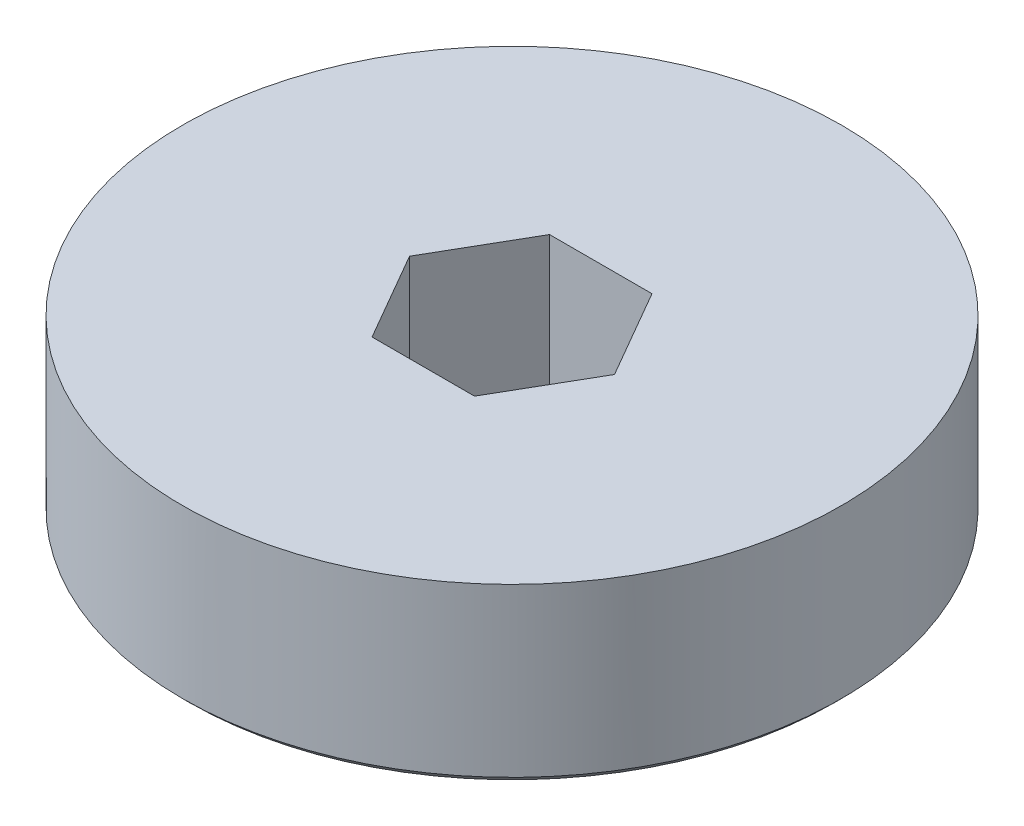
ISO-10303-21;
HEADER;
FILE_DESCRIPTION(('STEP AP214'),'2;1');
FILE_NAME('part.step','',(''),(''),'','','');
FILE_SCHEMA(('AUTOMOTIVE_DESIGN { 1 0 10303 214 1 1 1 1 }'));
ENDSEC;
DATA;
#1=APPLICATION_CONTEXT('core data for automotive mechanical design processes');
#2=APPLICATION_PROTOCOL_DEFINITION('international standard','automotive_design',2000,#1);
#3=PRODUCT_CONTEXT('',#1,'mechanical');
#4=PRODUCT('Part','Part','',(#3));
#5=PRODUCT_RELATED_PRODUCT_CATEGORY('part','',(#4));
#6=PRODUCT_DEFINITION_FORMATION('','',#4);
#7=PRODUCT_DEFINITION_CONTEXT('part definition',#1,'design');
#8=PRODUCT_DEFINITION('design','',#6,#7);
#9=PRODUCT_DEFINITION_SHAPE('','',#8);
#10=(LENGTH_UNIT() NAMED_UNIT(*) SI_UNIT(.MILLI.,.METRE.));
#11=(NAMED_UNIT(*) PLANE_ANGLE_UNIT() SI_UNIT($,.RADIAN.));
#12=(NAMED_UNIT(*) SI_UNIT($,.STERADIAN.) SOLID_ANGLE_UNIT());
#13=UNCERTAINTY_MEASURE_WITH_UNIT(LENGTH_MEASURE(1.E-05),#10,'distance_accuracy_value','');
#14=(GEOMETRIC_REPRESENTATION_CONTEXT(3) GLOBAL_UNCERTAINTY_ASSIGNED_CONTEXT((#13)) GLOBAL_UNIT_ASSIGNED_CONTEXT((#10,
#11,#12)) REPRESENTATION_CONTEXT('',''));
#15=CARTESIAN_POINT('',(0.,0.,0.));
#16=DIRECTION('',(0.,0.,1.));
#17=DIRECTION('',(1.,0.,0.));
#18=AXIS2_PLACEMENT_3D('',#15,#16,#17);
#19=CARTESIAN_POINT('',(0.,-10.16,0.));
#20=DIRECTION('',(0.,-1.,0.));
#21=DIRECTION('',(0.,0.,-1.));
#22=AXIS2_PLACEMENT_3D('',#19,#20,#21);
#23=CYLINDRICAL_SURFACE('',#22,7.9375);
#24=CARTESIAN_POINT('',(0.,-9.398,0.));
#25=DIRECTION('',(0.,-1.,0.));
#26=DIRECTION('',(0.,0.,-1.));
#27=AXIS2_PLACEMENT_3D('',#24,#25,#26);
#28=CIRCLE('',#27,7.9375);
#29=CARTESIAN_POINT('',(0.,-9.398,-7.9375));
#30=VERTEX_POINT('',#29);
#31=EDGE_CURVE('E79',#30,#30,#28,.F.);
#32=ORIENTED_EDGE('',*,*,#31,.F.);
#33=EDGE_LOOP('',(#32));
#34=FACE_BOUND('',#33,.T.);
#35=CARTESIAN_POINT('',(0.,-10.16,0.));
#36=DIRECTION('',(0.,-1.,0.));
#37=DIRECTION('',(0.,0.,-1.));
#38=AXIS2_PLACEMENT_3D('',#35,#36,#37);
#39=CIRCLE('',#38,7.9375);
#40=CARTESIAN_POINT('',(0.,-10.16,-7.9375));
#41=VERTEX_POINT('',#40);
#42=EDGE_CURVE('E20',#41,#41,#39,.F.);
#43=ORIENTED_EDGE('',*,*,#42,.T.);
#44=EDGE_LOOP('',(#43));
#45=FACE_BOUND('',#44,.T.);
#46=ADVANCED_FACE('F17',(#34,#45),#23,.T.);
#47=CARTESIAN_POINT('',(0.,-10.16,0.));
#48=DIRECTION('',(0.,1.,0.));
#49=DIRECTION('',(0.,0.,1.));
#50=AXIS2_PLACEMENT_3D('',#47,#48,#49);
#51=PLANE('',#50);
#52=DIRECTION('',(-1.,0.,0.));
#53=VECTOR('',#52,1.);
#54=CARTESIAN_POINT('',(-2.76429535385301,-10.16,4.78790000000001));
#55=LINE('',#54,#53);
#56=CARTESIAN_POINT('',(2.764295353853,-10.16,4.78790000000001));
#57=VERTEX_POINT('',#56);
#58=CARTESIAN_POINT('',(-2.76429535385301,-10.16,4.78790000000001));
#59=VERTEX_POINT('',#58);
#60=EDGE_CURVE('E71',#57,#59,#55,.T.);
#61=ORIENTED_EDGE('',*,*,#60,.F.);
#62=DIRECTION('',(-0.5,0.,0.866025403784439));
#63=VECTOR('',#62,1.);
#64=CARTESIAN_POINT('',(2.764295353853,-10.16,4.78790000000001));
#65=LINE('',#64,#63);
#66=CARTESIAN_POINT('',(5.52859070770601,-10.16,0.));
#67=VERTEX_POINT('',#66);
#68=EDGE_CURVE('E68',#67,#57,#65,.T.);
#69=ORIENTED_EDGE('',*,*,#68,.F.);
#70=DIRECTION('',(0.499999999999999,0.,0.866025403784439));
#71=VECTOR('',#70,1.);
#72=CARTESIAN_POINT('',(5.52859070770601,-10.16,0.));
#73=LINE('',#72,#71);
#74=CARTESIAN_POINT('',(2.764295353853,-10.16,-4.78789999999999));
#75=VERTEX_POINT('',#74);
#76=EDGE_CURVE('E88',#75,#67,#73,.T.);
#77=ORIENTED_EDGE('',*,*,#76,.F.);
#78=DIRECTION('',(1.,0.,0.));
#79=VECTOR('',#78,1.);
#80=CARTESIAN_POINT('',(2.764295353853,-10.16,-4.78789999999999));
#81=LINE('',#80,#79);
#82=CARTESIAN_POINT('',(-2.76429535385301,-10.16,-4.78789999999999));
#83=VERTEX_POINT('',#82);
#84=EDGE_CURVE('E203',#83,#75,#81,.T.);
#85=ORIENTED_EDGE('',*,*,#84,.F.);
#86=DIRECTION('',(0.5,0.,-0.866025403784439));
#87=VECTOR('',#86,1.);
#88=CARTESIAN_POINT('',(-2.76429535385301,-10.16,-4.78789999999999));
#89=LINE('',#88,#87);
#90=CARTESIAN_POINT('',(-5.52859070770602,-10.16,0.));
#91=VERTEX_POINT('',#90);
#92=EDGE_CURVE('E208',#91,#83,#89,.T.);
#93=ORIENTED_EDGE('',*,*,#92,.F.);
#94=DIRECTION('',(-0.5,0.,-0.866025403784439));
#95=VECTOR('',#94,1.);
#96=CARTESIAN_POINT('',(-5.52859070770602,-10.16,0.));
#97=LINE('',#96,#95);
#98=EDGE_CURVE('E76',#59,#91,#97,.T.);
#99=ORIENTED_EDGE('',*,*,#98,.F.);
#100=EDGE_LOOP('',(#61,#69,#77,#85,#93,#99));
#101=FACE_BOUND('',#100,.T.);
#102=ORIENTED_EDGE('',*,*,#42,.F.);
#103=EDGE_LOOP('',(#102));
#104=FACE_BOUND('',#103,.T.);
#105=ADVANCED_FACE('F73',(#101,#104),#51,.F.);
#106=CARTESIAN_POINT('',(0.,-9.398,0.));
#107=DIRECTION('',(0.,-1.,0.));
#108=DIRECTION('',(0.,0.,-1.));
#109=AXIS2_PLACEMENT_3D('',#106,#107,#108);
#110=PLANE('',#109);
#111=ORIENTED_EDGE('',*,*,#31,.T.);
#112=EDGE_LOOP('',(#111));
#113=FACE_BOUND('',#112,.T.);
#114=CARTESIAN_POINT('',(0.,-9.398,0.));
#115=DIRECTION('',(0.,1.,0.));
#116=DIRECTION('',(0.,0.,1.));
#117=AXIS2_PLACEMENT_3D('',#114,#115,#116);
#118=CIRCLE('',#117,17.399);
#119=CARTESIAN_POINT('',(0.,-9.398,17.399));
#120=VERTEX_POINT('',#119);
#121=EDGE_CURVE('E97',#120,#120,#118,.T.);
#122=ORIENTED_EDGE('',*,*,#121,.F.);
#123=EDGE_LOOP('',(#122));
#124=FACE_BOUND('',#123,.T.);
#125=ADVANCED_FACE('F107',(#113,#124),#110,.T.);
#126=CARTESIAN_POINT('',(-2.76429535385301,41.1454850868793,4.78790000000001));
#127=DIRECTION('',(0.,0.,-1.));
#128=DIRECTION('',(-1.,0.,0.));
#129=AXIS2_PLACEMENT_3D('',#126,#127,#128);
#130=PLANE('',#129);
#131=ORIENTED_EDGE('',*,*,#60,.T.);
#132=DIRECTION('',(0.,1.,0.));
#133=VECTOR('',#132,1.);
#134=CARTESIAN_POINT('',(-2.76429535385301,41.1454850868793,4.78790000000001));
#135=LINE('',#134,#133);
#136=CARTESIAN_POINT('',(-2.76429535385301,0.,4.78790000000001));
#137=VERTEX_POINT('',#136);
#138=EDGE_CURVE('E213',#137,#59,#135,.F.);
#139=ORIENTED_EDGE('',*,*,#138,.F.);
#140=DIRECTION('',(1.,0.,0.));
#141=VECTOR('',#140,1.);
#142=CARTESIAN_POINT('',(0.,0.,4.78790000000001));
#143=LINE('',#142,#141);
#144=CARTESIAN_POINT('',(2.764295353853,0.,4.78790000000001));
#145=VERTEX_POINT('',#144);
#146=EDGE_CURVE('E85',#137,#145,#143,.T.);
#147=ORIENTED_EDGE('',*,*,#146,.T.);
#148=DIRECTION('',(0.,1.,0.));
#149=VECTOR('',#148,1.);
#150=CARTESIAN_POINT('',(2.764295353853,41.1454850868793,4.78790000000001));
#151=LINE('',#150,#149);
#152=EDGE_CURVE('E82',#57,#145,#151,.T.);
#153=ORIENTED_EDGE('',*,*,#152,.F.);
#154=EDGE_LOOP('',(#131,#139,#147,#153));
#155=FACE_BOUND('',#154,.T.);
#156=ADVANCED_FACE('F83',(#155),#130,.T.);
#157=CARTESIAN_POINT('',(2.764295353853,41.1454850868793,4.78790000000001));
#158=DIRECTION('',(-0.866025403784439,0.,-0.5));
#159=DIRECTION('',(-0.5,0.,0.866025403784439));
#160=AXIS2_PLACEMENT_3D('',#157,#158,#159);
#161=PLANE('',#160);
#162=ORIENTED_EDGE('',*,*,#68,.T.);
#163=ORIENTED_EDGE('',*,*,#152,.T.);
#164=DIRECTION('',(0.5,0.,-0.866025403784439));
#165=VECTOR('',#164,1.);
#166=CARTESIAN_POINT('',(2.764295353853,0.,4.78790000000001));
#167=LINE('',#166,#165);
#168=CARTESIAN_POINT('',(5.52859070770601,0.,0.));
#169=VERTEX_POINT('',#168);
#170=EDGE_CURVE('E218',#145,#169,#167,.T.);
#171=ORIENTED_EDGE('',*,*,#170,.T.);
#172=DIRECTION('',(0.,1.,0.));
#173=VECTOR('',#172,1.);
#174=CARTESIAN_POINT('',(5.52859070770601,41.1454850868793,0.));
#175=LINE('',#174,#173);
#176=EDGE_CURVE('E92',#67,#169,#175,.T.);
#177=ORIENTED_EDGE('',*,*,#176,.F.);
#178=EDGE_LOOP('',(#162,#163,#171,#177));
#179=FACE_BOUND('',#178,.T.);
#180=ADVANCED_FACE('F90',(#179),#161,.T.);
#181=CARTESIAN_POINT('',(5.52859070770601,41.1454850868793,0.));
#182=DIRECTION('',(-0.866025403784439,0.,0.499999999999999));
#183=DIRECTION('',(0.499999999999999,0.,0.866025403784439));
#184=AXIS2_PLACEMENT_3D('',#181,#182,#183);
#185=PLANE('',#184);
#186=ORIENTED_EDGE('',*,*,#76,.T.);
#187=ORIENTED_EDGE('',*,*,#176,.T.);
#188=DIRECTION('',(-0.499999999999999,0.,-0.866025403784439));
#189=VECTOR('',#188,1.);
#190=CARTESIAN_POINT('',(5.52859070770601,0.,0.));
#191=LINE('',#190,#189);
#192=CARTESIAN_POINT('',(2.764295353853,0.,-4.7879));
#193=VERTEX_POINT('',#192);
#194=EDGE_CURVE('E220',#169,#193,#191,.T.);
#195=ORIENTED_EDGE('',*,*,#194,.T.);
#196=DIRECTION('',(0.,1.,0.));
#197=VECTOR('',#196,1.);
#198=CARTESIAN_POINT('',(2.764295353853,41.1454850868793,-4.78789999999999));
#199=LINE('',#198,#197);
#200=EDGE_CURVE('E201',#75,#193,#199,.T.);
#201=ORIENTED_EDGE('',*,*,#200,.F.);
#202=EDGE_LOOP('',(#186,#187,#195,#201));
#203=FACE_BOUND('',#202,.T.);
#204=ADVANCED_FACE('F141',(#203),#185,.T.);
#205=CARTESIAN_POINT('',(2.764295353853,41.1454850868793,-4.78789999999999));
#206=DIRECTION('',(0.,0.,1.));
#207=DIRECTION('',(1.,0.,0.));
#208=AXIS2_PLACEMENT_3D('',#205,#206,#207);
#209=PLANE('',#208);
#210=ORIENTED_EDGE('',*,*,#84,.T.);
#211=ORIENTED_EDGE('',*,*,#200,.T.);
#212=DIRECTION('',(1.,0.,0.));
#213=VECTOR('',#212,1.);
#214=CARTESIAN_POINT('',(0.,0.,-4.7879));
#215=LINE('',#214,#213);
#216=CARTESIAN_POINT('',(-2.76429535385301,0.,-4.78789999999999));
#217=VERTEX_POINT('',#216);
#218=EDGE_CURVE('E222',#193,#217,#215,.F.);
#219=ORIENTED_EDGE('',*,*,#218,.T.);
#220=DIRECTION('',(0.,1.,0.));
#221=VECTOR('',#220,1.);
#222=CARTESIAN_POINT('',(-2.76429535385301,41.1454850868793,-4.78789999999999));
#223=LINE('',#222,#221);
#224=EDGE_CURVE('E211',#83,#217,#223,.T.);
#225=ORIENTED_EDGE('',*,*,#224,.F.);
#226=EDGE_LOOP('',(#210,#211,#219,#225));
#227=FACE_BOUND('',#226,.T.);
#228=ADVANCED_FACE('F138',(#227),#209,.T.);
#229=CARTESIAN_POINT('',(-2.76429535385301,41.1454850868793,-4.78789999999999));
#230=DIRECTION('',(0.866025403784439,0.,0.5));
#231=DIRECTION('',(0.5,0.,-0.866025403784439));
#232=AXIS2_PLACEMENT_3D('',#229,#230,#231);
#233=PLANE('',#232);
#234=ORIENTED_EDGE('',*,*,#92,.T.);
#235=ORIENTED_EDGE('',*,*,#224,.T.);
#236=DIRECTION('',(-0.5,0.,0.866025403784438));
#237=VECTOR('',#236,1.);
#238=CARTESIAN_POINT('',(-2.76429535385301,0.,-4.78789999999999));
#239=LINE('',#238,#237);
#240=CARTESIAN_POINT('',(-5.52859070770602,0.,0.));
#241=VERTEX_POINT('',#240);
#242=EDGE_CURVE('E35',#217,#241,#239,.T.);
#243=ORIENTED_EDGE('',*,*,#242,.T.);
#244=DIRECTION('',(0.,1.,0.));
#245=VECTOR('',#244,1.);
#246=CARTESIAN_POINT('',(-5.52859070770602,41.1454850868793,0.));
#247=LINE('',#246,#245);
#248=EDGE_CURVE('E99',#91,#241,#247,.T.);
#249=ORIENTED_EDGE('',*,*,#248,.F.);
#250=EDGE_LOOP('',(#234,#235,#243,#249));
#251=FACE_BOUND('',#250,.T.);
#252=ADVANCED_FACE('F134',(#251),#233,.T.);
#253=CARTESIAN_POINT('',(-5.52859070770602,41.1454850868793,0.));
#254=DIRECTION('',(0.866025403784439,0.,-0.5));
#255=DIRECTION('',(-0.5,0.,-0.866025403784439));
#256=AXIS2_PLACEMENT_3D('',#253,#254,#255);
#257=PLANE('',#256);
#258=ORIENTED_EDGE('',*,*,#98,.T.);
#259=ORIENTED_EDGE('',*,*,#248,.T.);
#260=DIRECTION('',(0.5,0.,0.866025403784439));
#261=VECTOR('',#260,1.);
#262=CARTESIAN_POINT('',(-5.52859070770602,0.,0.));
#263=LINE('',#262,#261);
#264=EDGE_CURVE('E225',#241,#137,#263,.T.);
#265=ORIENTED_EDGE('',*,*,#264,.T.);
#266=ORIENTED_EDGE('',*,*,#138,.T.);
#267=EDGE_LOOP('',(#258,#259,#265,#266));
#268=FACE_BOUND('',#267,.T.);
#269=ADVANCED_FACE('F130',(#268),#257,.T.);
#270=CARTESIAN_POINT('',(0.,-9.017,0.));
#271=DIRECTION('',(0.,1.,0.));
#272=DIRECTION('',(0.,0.,1.));
#273=AXIS2_PLACEMENT_3D('',#270,#271,#272);
#274=CONICAL_SURFACE('',#273,17.78,0.785398163397448);
#275=ORIENTED_EDGE('',*,*,#121,.T.);
#276=EDGE_LOOP('',(#275));
#277=FACE_BOUND('',#276,.T.);
#278=CARTESIAN_POINT('',(0.,-9.017,0.));
#279=DIRECTION('',(0.,-1.,0.));
#280=DIRECTION('',(0.,0.,-1.));
#281=AXIS2_PLACEMENT_3D('',#278,#279,#280);
#282=CIRCLE('',#281,17.78);
#283=CARTESIAN_POINT('',(0.,-9.017,-17.78));
#284=VERTEX_POINT('',#283);
#285=EDGE_CURVE('E26',#284,#284,#282,.F.);
#286=ORIENTED_EDGE('',*,*,#285,.F.);
#287=EDGE_LOOP('',(#286));
#288=FACE_BOUND('',#287,.T.);
#289=ADVANCED_FACE('F123',(#277,#288),#274,.T.);
#290=CARTESIAN_POINT('',(0.,0.,0.));
#291=DIRECTION('',(0.,-1.,0.));
#292=DIRECTION('',(0.,0.,-1.));
#293=AXIS2_PLACEMENT_3D('',#290,#291,#292);
#294=PLANE('',#293);
#295=ORIENTED_EDGE('',*,*,#242,.F.);
#296=ORIENTED_EDGE('',*,*,#218,.F.);
#297=ORIENTED_EDGE('',*,*,#194,.F.);
#298=ORIENTED_EDGE('',*,*,#170,.F.);
#299=ORIENTED_EDGE('',*,*,#146,.F.);
#300=ORIENTED_EDGE('',*,*,#264,.F.);
#301=EDGE_LOOP('',(#295,#296,#297,#298,#299,#300));
#302=FACE_BOUND('',#301,.T.);
#303=CARTESIAN_POINT('',(0.,0.,0.));
#304=DIRECTION('',(0.,-1.,0.));
#305=DIRECTION('',(0.,0.,-1.));
#306=AXIS2_PLACEMENT_3D('',#303,#304,#305);
#307=CIRCLE('',#306,17.78);
#308=CARTESIAN_POINT('',(0.,0.,-17.78));
#309=VERTEX_POINT('',#308);
#310=EDGE_CURVE('E11',#309,#309,#307,.T.);
#311=ORIENTED_EDGE('',*,*,#310,.F.);
#312=EDGE_LOOP('',(#311));
#313=FACE_BOUND('',#312,.T.);
#314=ADVANCED_FACE('F117',(#302,#313),#294,.F.);
#315=CARTESIAN_POINT('',(0.,-9.398,0.));
#316=DIRECTION('',(0.,-1.,0.));
#317=DIRECTION('',(0.,0.,-1.));
#318=AXIS2_PLACEMENT_3D('',#315,#316,#317);
#319=CYLINDRICAL_SURFACE('',#318,17.78);
#320=ORIENTED_EDGE('',*,*,#310,.T.);
#321=EDGE_LOOP('',(#320));
#322=FACE_BOUND('',#321,.T.);
#323=ORIENTED_EDGE('',*,*,#285,.T.);
#324=EDGE_LOOP('',(#323));
#325=FACE_BOUND('',#324,.T.);
#326=ADVANCED_FACE('F115',(#322,#325),#319,.T.);
#327=CLOSED_SHELL('',(#46,#105,#125,#156,#180,#204,#228,#252,#269,#289,#314,#326));
#328=MANIFOLD_SOLID_BREP('B1',#327);
#329=ADVANCED_BREP_SHAPE_REPRESENTATION('',(#18,#328),#14);
#330=SHAPE_DEFINITION_REPRESENTATION(#9,#329);
ENDSEC;
END-ISO-10303-21;
